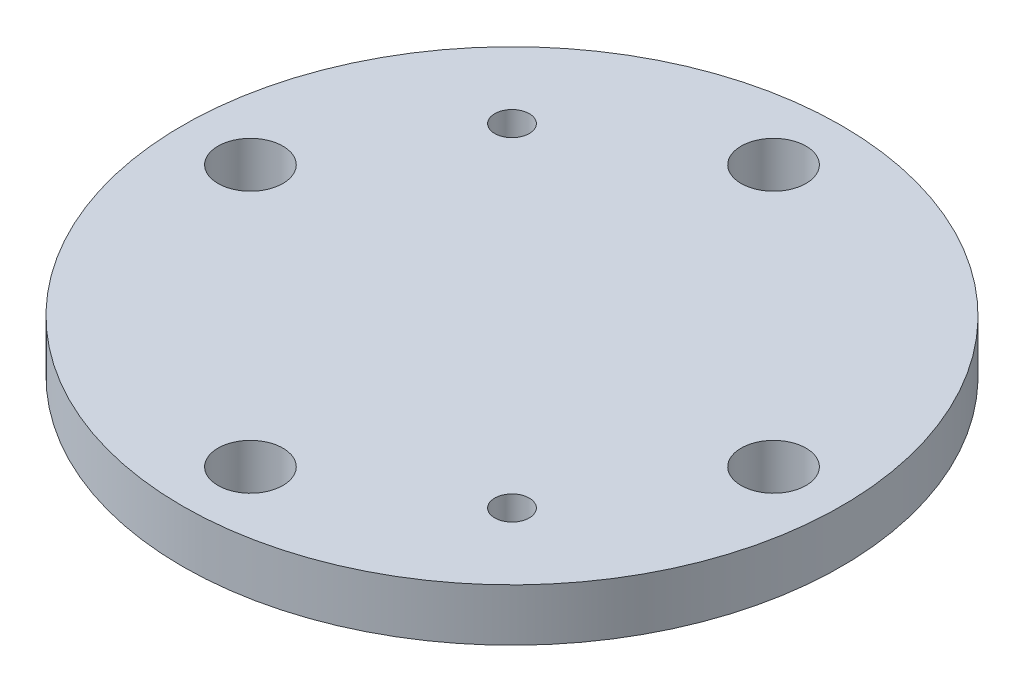
ISO-10303-21;
HEADER;
FILE_DESCRIPTION(('STEP AP214'),'2;1');
FILE_NAME('part.step','',(''),(''),'','','');
FILE_SCHEMA(('AUTOMOTIVE_DESIGN { 1 0 10303 214 1 1 1 1 }'));
ENDSEC;
DATA;
#1=APPLICATION_CONTEXT('core data for automotive mechanical design processes');
#2=APPLICATION_PROTOCOL_DEFINITION('international standard','automotive_design',2000,#1);
#3=PRODUCT_CONTEXT('',#1,'mechanical');
#4=PRODUCT('Part','Part','',(#3));
#5=PRODUCT_RELATED_PRODUCT_CATEGORY('part','',(#4));
#6=PRODUCT_DEFINITION_FORMATION('','',#4);
#7=PRODUCT_DEFINITION_CONTEXT('part definition',#1,'design');
#8=PRODUCT_DEFINITION('design','',#6,#7);
#9=PRODUCT_DEFINITION_SHAPE('','',#8);
#10=(LENGTH_UNIT() NAMED_UNIT(*) SI_UNIT(.MILLI.,.METRE.));
#11=(NAMED_UNIT(*) PLANE_ANGLE_UNIT() SI_UNIT($,.RADIAN.));
#12=(NAMED_UNIT(*) SI_UNIT($,.STERADIAN.) SOLID_ANGLE_UNIT());
#13=UNCERTAINTY_MEASURE_WITH_UNIT(LENGTH_MEASURE(1.E-05),#10,'distance_accuracy_value','');
#14=(GEOMETRIC_REPRESENTATION_CONTEXT(3) GLOBAL_UNCERTAINTY_ASSIGNED_CONTEXT((#13)) GLOBAL_UNIT_ASSIGNED_CONTEXT((#10,
#11,#12)) REPRESENTATION_CONTEXT('',''));
#15=CARTESIAN_POINT('',(0.,0.,0.));
#16=DIRECTION('',(0.,0.,1.));
#17=DIRECTION('',(1.,0.,0.));
#18=AXIS2_PLACEMENT_3D('',#15,#16,#17);
#19=CARTESIAN_POINT('',(0.,5.,0.));
#20=DIRECTION('',(0.,1.,0.));
#21=DIRECTION('',(0.,0.,1.));
#22=AXIS2_PLACEMENT_3D('',#19,#20,#21);
#23=PLANE('',#22);
#24=CARTESIAN_POINT('',(-15.9099025766972,5.,-15.9099025766974));
#25=DIRECTION('',(0.,1.,0.));
#26=DIRECTION('',(0.,0.,1.));
#27=AXIS2_PLACEMENT_3D('',#24,#25,#26);
#28=CIRCLE('',#27,1.65);
#29=CARTESIAN_POINT('',(-15.9099025766972,5.,-14.2599025766974));
#30=VERTEX_POINT('',#29);
#31=EDGE_CURVE('E116',#30,#30,#28,.T.);
#32=ORIENTED_EDGE('',*,*,#31,.F.);
#33=EDGE_LOOP('',(#32));
#34=FACE_BOUND('',#33,.T.);
#35=CARTESIAN_POINT('',(25.,5.,0.));
#36=DIRECTION('',(0.,1.,0.));
#37=DIRECTION('',(0.,0.,1.));
#38=AXIS2_PLACEMENT_3D('',#35,#36,#37);
#39=CIRCLE('',#38,3.1);
#40=CARTESIAN_POINT('',(25.,5.,3.1));
#41=VERTEX_POINT('',#40);
#42=EDGE_CURVE('E100',#41,#41,#39,.T.);
#43=ORIENTED_EDGE('',*,*,#42,.F.);
#44=EDGE_LOOP('',(#43));
#45=FACE_BOUND('',#44,.T.);
#46=CARTESIAN_POINT('',(-25.,5.,0.));
#47=DIRECTION('',(0.,1.,0.));
#48=DIRECTION('',(0.,0.,1.));
#49=AXIS2_PLACEMENT_3D('',#46,#47,#48);
#50=CIRCLE('',#49,3.1);
#51=CARTESIAN_POINT('',(-25.,5.,3.1));
#52=VERTEX_POINT('',#51);
#53=EDGE_CURVE('E86',#52,#52,#50,.T.);
#54=ORIENTED_EDGE('',*,*,#53,.F.);
#55=EDGE_LOOP('',(#54));
#56=FACE_BOUND('',#55,.T.);
#57=CARTESIAN_POINT('',(0.,5.,0.));
#58=DIRECTION('',(0.,1.,0.));
#59=DIRECTION('',(0.,0.,1.));
#60=AXIS2_PLACEMENT_3D('',#57,#58,#59);
#61=CIRCLE('',#60,31.5);
#62=CARTESIAN_POINT('',(0.,5.,31.5));
#63=VERTEX_POINT('',#62);
#64=EDGE_CURVE('E11',#63,#63,#61,.T.);
#65=ORIENTED_EDGE('',*,*,#64,.T.);
#66=EDGE_LOOP('',(#65));
#67=FACE_BOUND('',#66,.T.);
#68=CARTESIAN_POINT('',(0.,5.,-25.));
#69=DIRECTION('',(0.,1.,0.));
#70=DIRECTION('',(0.,0.,1.));
#71=AXIS2_PLACEMENT_3D('',#68,#69,#70);
#72=CIRCLE('',#71,3.1);
#73=CARTESIAN_POINT('',(0.,5.,-21.9));
#74=VERTEX_POINT('',#73);
#75=EDGE_CURVE('E92',#74,#74,#72,.T.);
#76=ORIENTED_EDGE('',*,*,#75,.F.);
#77=EDGE_LOOP('',(#76));
#78=FACE_BOUND('',#77,.T.);
#79=CARTESIAN_POINT('',(0.,5.,25.));
#80=DIRECTION('',(0.,1.,0.));
#81=DIRECTION('',(0.,0.,1.));
#82=AXIS2_PLACEMENT_3D('',#79,#80,#81);
#83=CIRCLE('',#82,3.1);
#84=CARTESIAN_POINT('',(0.,5.,28.1));
#85=VERTEX_POINT('',#84);
#86=EDGE_CURVE('E108',#85,#85,#83,.T.);
#87=ORIENTED_EDGE('',*,*,#86,.F.);
#88=EDGE_LOOP('',(#87));
#89=FACE_BOUND('',#88,.T.);
#90=CARTESIAN_POINT('',(15.9099025766972,5.,15.9099025766974));
#91=DIRECTION('',(0.,1.,0.));
#92=DIRECTION('',(0.,0.,1.));
#93=AXIS2_PLACEMENT_3D('',#90,#91,#92);
#94=CIRCLE('',#93,1.64999999999999);
#95=CARTESIAN_POINT('',(15.9099025766972,5.,17.5599025766974));
#96=VERTEX_POINT('',#95);
#97=EDGE_CURVE('E124',#96,#96,#94,.T.);
#98=ORIENTED_EDGE('',*,*,#97,.F.);
#99=EDGE_LOOP('',(#98));
#100=FACE_BOUND('',#99,.T.);
#101=ADVANCED_FACE('F73',(#34,#45,#56,#67,#78,#89,#100),#23,.T.);
#102=CARTESIAN_POINT('',(0.,0.,0.));
#103=DIRECTION('',(0.,1.,0.));
#104=DIRECTION('',(0.,0.,1.));
#105=AXIS2_PLACEMENT_3D('',#102,#103,#104);
#106=PLANE('',#105);
#107=CARTESIAN_POINT('',(0.,0.,0.));
#108=DIRECTION('',(0.,1.,0.));
#109=DIRECTION('',(0.,0.,1.));
#110=AXIS2_PLACEMENT_3D('',#107,#108,#109);
#111=CIRCLE('',#110,31.5);
#112=CARTESIAN_POINT('',(0.,0.,31.5));
#113=VERTEX_POINT('',#112);
#114=EDGE_CURVE('E77',#113,#113,#111,.T.);
#115=ORIENTED_EDGE('',*,*,#114,.F.);
#116=EDGE_LOOP('',(#115));
#117=FACE_BOUND('',#116,.T.);
#118=CARTESIAN_POINT('',(-25.,0.,0.));
#119=DIRECTION('',(0.,1.,0.));
#120=DIRECTION('',(0.,0.,1.));
#121=AXIS2_PLACEMENT_3D('',#118,#119,#120);
#122=CIRCLE('',#121,3.1);
#123=CARTESIAN_POINT('',(-25.,0.,3.1));
#124=VERTEX_POINT('',#123);
#125=EDGE_CURVE('E88',#124,#124,#122,.T.);
#126=ORIENTED_EDGE('',*,*,#125,.T.);
#127=EDGE_LOOP('',(#126));
#128=FACE_BOUND('',#127,.T.);
#129=CARTESIAN_POINT('',(0.,0.,-25.));
#130=DIRECTION('',(0.,1.,0.));
#131=DIRECTION('',(0.,0.,1.));
#132=AXIS2_PLACEMENT_3D('',#129,#130,#131);
#133=CIRCLE('',#132,3.1);
#134=CARTESIAN_POINT('',(0.,0.,-21.9));
#135=VERTEX_POINT('',#134);
#136=EDGE_CURVE('E96',#135,#135,#133,.T.);
#137=ORIENTED_EDGE('',*,*,#136,.T.);
#138=EDGE_LOOP('',(#137));
#139=FACE_BOUND('',#138,.T.);
#140=CARTESIAN_POINT('',(25.,0.,0.));
#141=DIRECTION('',(0.,1.,0.));
#142=DIRECTION('',(0.,0.,1.));
#143=AXIS2_PLACEMENT_3D('',#140,#141,#142);
#144=CIRCLE('',#143,3.1);
#145=CARTESIAN_POINT('',(25.,0.,3.1));
#146=VERTEX_POINT('',#145);
#147=EDGE_CURVE('E104',#146,#146,#144,.T.);
#148=ORIENTED_EDGE('',*,*,#147,.T.);
#149=EDGE_LOOP('',(#148));
#150=FACE_BOUND('',#149,.T.);
#151=CARTESIAN_POINT('',(0.,0.,25.));
#152=DIRECTION('',(0.,1.,0.));
#153=DIRECTION('',(0.,0.,1.));
#154=AXIS2_PLACEMENT_3D('',#151,#152,#153);
#155=CIRCLE('',#154,3.1);
#156=CARTESIAN_POINT('',(0.,0.,28.1));
#157=VERTEX_POINT('',#156);
#158=EDGE_CURVE('E112',#157,#157,#155,.T.);
#159=ORIENTED_EDGE('',*,*,#158,.T.);
#160=EDGE_LOOP('',(#159));
#161=FACE_BOUND('',#160,.T.);
#162=CARTESIAN_POINT('',(-15.9099025766972,0.,-15.9099025766974));
#163=DIRECTION('',(0.,1.,0.));
#164=DIRECTION('',(0.,0.,1.));
#165=AXIS2_PLACEMENT_3D('',#162,#163,#164);
#166=CIRCLE('',#165,1.65);
#167=CARTESIAN_POINT('',(-15.9099025766972,0.,-14.2599025766974));
#168=VERTEX_POINT('',#167);
#169=EDGE_CURVE('E120',#168,#168,#166,.T.);
#170=ORIENTED_EDGE('',*,*,#169,.T.);
#171=EDGE_LOOP('',(#170));
#172=FACE_BOUND('',#171,.T.);
#173=CARTESIAN_POINT('',(15.9099025766972,0.,15.9099025766974));
#174=DIRECTION('',(0.,1.,0.));
#175=DIRECTION('',(0.,0.,1.));
#176=AXIS2_PLACEMENT_3D('',#173,#174,#175);
#177=CIRCLE('',#176,1.64999999999999);
#178=CARTESIAN_POINT('',(15.9099025766972,0.,17.5599025766974));
#179=VERTEX_POINT('',#178);
#180=EDGE_CURVE('E128',#179,#179,#177,.T.);
#181=ORIENTED_EDGE('',*,*,#180,.T.);
#182=EDGE_LOOP('',(#181));
#183=FACE_BOUND('',#182,.T.);
#184=ADVANCED_FACE('F140',(#117,#128,#139,#150,#161,#172,#183),#106,.F.);
#185=CARTESIAN_POINT('',(0.,5.,0.));
#186=DIRECTION('',(0.,-1.,0.));
#187=DIRECTION('',(0.,0.,-1.));
#188=AXIS2_PLACEMENT_3D('',#185,#186,#187);
#189=CYLINDRICAL_SURFACE('',#188,31.5);
#190=ORIENTED_EDGE('',*,*,#64,.F.);
#191=EDGE_LOOP('',(#190));
#192=FACE_BOUND('',#191,.T.);
#193=ORIENTED_EDGE('',*,*,#114,.T.);
#194=EDGE_LOOP('',(#193));
#195=FACE_BOUND('',#194,.T.);
#196=ADVANCED_FACE('F75',(#192,#195),#189,.T.);
#197=CARTESIAN_POINT('',(-25.,5.,0.));
#198=DIRECTION('',(0.,-1.,0.));
#199=DIRECTION('',(0.,0.,-1.));
#200=AXIS2_PLACEMENT_3D('',#197,#198,#199);
#201=CYLINDRICAL_SURFACE('',#200,3.1);
#202=ORIENTED_EDGE('',*,*,#53,.T.);
#203=EDGE_LOOP('',(#202));
#204=FACE_BOUND('',#203,.T.);
#205=ORIENTED_EDGE('',*,*,#125,.F.);
#206=EDGE_LOOP('',(#205));
#207=FACE_BOUND('',#206,.T.);
#208=ADVANCED_FACE('F150',(#204,#207),#201,.F.);
#209=CARTESIAN_POINT('',(0.,5.,-25.));
#210=DIRECTION('',(0.,-1.,0.));
#211=DIRECTION('',(0.,0.,-1.));
#212=AXIS2_PLACEMENT_3D('',#209,#210,#211);
#213=CYLINDRICAL_SURFACE('',#212,3.1);
#214=ORIENTED_EDGE('',*,*,#75,.T.);
#215=EDGE_LOOP('',(#214));
#216=FACE_BOUND('',#215,.T.);
#217=ORIENTED_EDGE('',*,*,#136,.F.);
#218=EDGE_LOOP('',(#217));
#219=FACE_BOUND('',#218,.T.);
#220=ADVANCED_FACE('F153',(#216,#219),#213,.F.);
#221=CARTESIAN_POINT('',(25.,5.,0.));
#222=DIRECTION('',(0.,-1.,0.));
#223=DIRECTION('',(0.,0.,-1.));
#224=AXIS2_PLACEMENT_3D('',#221,#222,#223);
#225=CYLINDRICAL_SURFACE('',#224,3.1);
#226=ORIENTED_EDGE('',*,*,#42,.T.);
#227=EDGE_LOOP('',(#226));
#228=FACE_BOUND('',#227,.T.);
#229=ORIENTED_EDGE('',*,*,#147,.F.);
#230=EDGE_LOOP('',(#229));
#231=FACE_BOUND('',#230,.T.);
#232=ADVANCED_FACE('F157',(#228,#231),#225,.F.);
#233=CARTESIAN_POINT('',(0.,5.,25.));
#234=DIRECTION('',(0.,-1.,0.));
#235=DIRECTION('',(0.,0.,-1.));
#236=AXIS2_PLACEMENT_3D('',#233,#234,#235);
#237=CYLINDRICAL_SURFACE('',#236,3.1);
#238=ORIENTED_EDGE('',*,*,#86,.T.);
#239=EDGE_LOOP('',(#238));
#240=FACE_BOUND('',#239,.T.);
#241=ORIENTED_EDGE('',*,*,#158,.F.);
#242=EDGE_LOOP('',(#241));
#243=FACE_BOUND('',#242,.T.);
#244=ADVANCED_FACE('F161',(#240,#243),#237,.F.);
#245=CARTESIAN_POINT('',(-15.9099025766972,5.,-15.9099025766974));
#246=DIRECTION('',(0.,-1.,0.));
#247=DIRECTION('',(0.,0.,-1.));
#248=AXIS2_PLACEMENT_3D('',#245,#246,#247);
#249=CYLINDRICAL_SURFACE('',#248,1.65);
#250=ORIENTED_EDGE('',*,*,#31,.T.);
#251=EDGE_LOOP('',(#250));
#252=FACE_BOUND('',#251,.T.);
#253=ORIENTED_EDGE('',*,*,#169,.F.);
#254=EDGE_LOOP('',(#253));
#255=FACE_BOUND('',#254,.T.);
#256=ADVANCED_FACE('F165',(#252,#255),#249,.F.);
#257=CARTESIAN_POINT('',(15.9099025766972,5.,15.9099025766974));
#258=DIRECTION('',(0.,-1.,0.));
#259=DIRECTION('',(0.,0.,-1.));
#260=AXIS2_PLACEMENT_3D('',#257,#258,#259);
#261=CYLINDRICAL_SURFACE('',#260,1.64999999999999);
#262=ORIENTED_EDGE('',*,*,#97,.T.);
#263=EDGE_LOOP('',(#262));
#264=FACE_BOUND('',#263,.T.);
#265=ORIENTED_EDGE('',*,*,#180,.F.);
#266=EDGE_LOOP('',(#265));
#267=FACE_BOUND('',#266,.T.);
#268=ADVANCED_FACE('F136',(#264,#267),#261,.F.);
#269=CLOSED_SHELL('',(#101,#184,#196,#208,#220,#232,#244,#256,#268));
#270=MANIFOLD_SOLID_BREP('B2',#269);
#271=ADVANCED_BREP_SHAPE_REPRESENTATION('',(#18,#270),#14);
#272=SHAPE_DEFINITION_REPRESENTATION(#9,#271);
ENDSEC;
END-ISO-10303-21;
